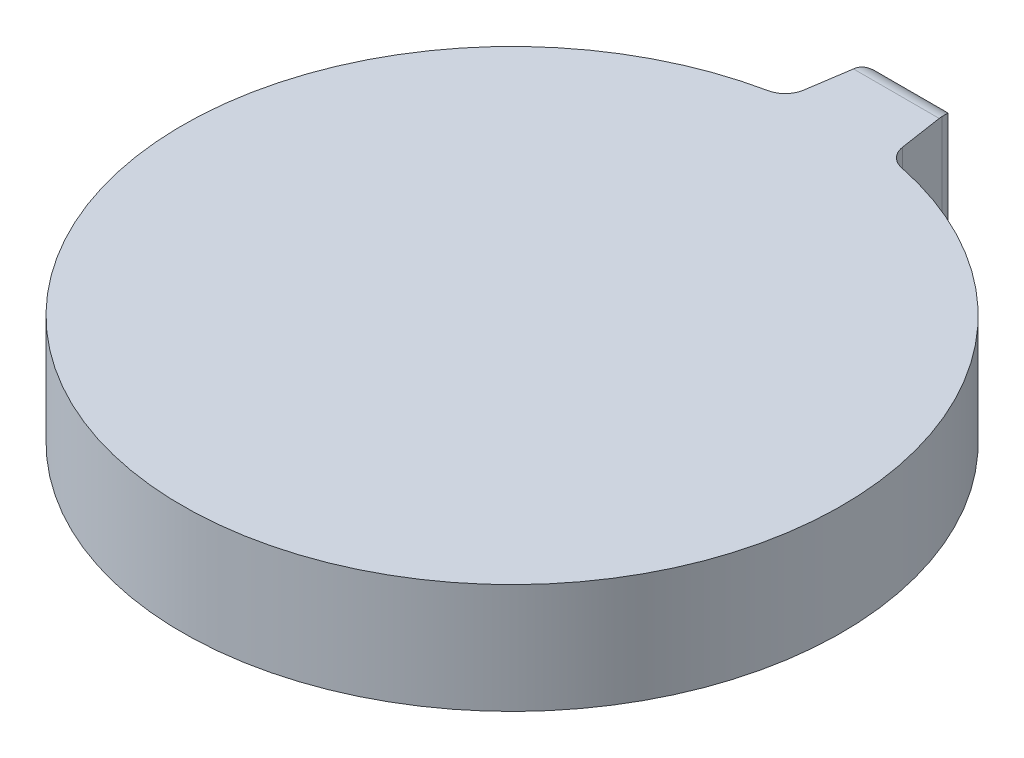
ISO-10303-21;
HEADER;
FILE_DESCRIPTION(('STEP AP214'),'2;1');
FILE_NAME('part.step','',(''),(''),'','','');
FILE_SCHEMA(('AUTOMOTIVE_DESIGN { 1 0 10303 214 1 1 1 1 }'));
ENDSEC;
DATA;
#1=APPLICATION_CONTEXT('core data for automotive mechanical design processes');
#2=APPLICATION_PROTOCOL_DEFINITION('international standard','automotive_design',2000,#1);
#3=PRODUCT_CONTEXT('',#1,'mechanical');
#4=PRODUCT('Part','Part','',(#3));
#5=PRODUCT_RELATED_PRODUCT_CATEGORY('part','',(#4));
#6=PRODUCT_DEFINITION_FORMATION('','',#4);
#7=PRODUCT_DEFINITION_CONTEXT('part definition',#1,'design');
#8=PRODUCT_DEFINITION('design','',#6,#7);
#9=PRODUCT_DEFINITION_SHAPE('','',#8);
#10=(LENGTH_UNIT() NAMED_UNIT(*) SI_UNIT(.MILLI.,.METRE.));
#11=(NAMED_UNIT(*) PLANE_ANGLE_UNIT() SI_UNIT($,.RADIAN.));
#12=(NAMED_UNIT(*) SI_UNIT($,.STERADIAN.) SOLID_ANGLE_UNIT());
#13=UNCERTAINTY_MEASURE_WITH_UNIT(LENGTH_MEASURE(1.E-05),#10,'distance_accuracy_value','');
#14=(GEOMETRIC_REPRESENTATION_CONTEXT(3) GLOBAL_UNCERTAINTY_ASSIGNED_CONTEXT((#13)) GLOBAL_UNIT_ASSIGNED_CONTEXT((#10,
#11,#12)) REPRESENTATION_CONTEXT('',''));
#15=CARTESIAN_POINT('',(0.,0.,0.));
#16=DIRECTION('',(0.,0.,1.));
#17=DIRECTION('',(1.,0.,0.));
#18=AXIS2_PLACEMENT_3D('',#15,#16,#17);
#19=CARTESIAN_POINT('',(0.,6.35,0.));
#20=DIRECTION('',(0.,-1.,0.));
#21=DIRECTION('',(0.,0.,-1.));
#22=AXIS2_PLACEMENT_3D('',#19,#20,#21);
#23=CYLINDRICAL_SURFACE('',#22,19.05);
#24=CARTESIAN_POINT('',(0.,6.35,0.));
#25=DIRECTION('',(0.,1.,0.));
#26=DIRECTION('',(0.,0.,1.));
#27=AXIS2_PLACEMENT_3D('',#24,#25,#26);
#28=CIRCLE('',#27,19.05);
#29=CARTESIAN_POINT('',(-3.85523550242313,6.35,-18.6558210545893));
#30=VERTEX_POINT('',#29);
#31=CARTESIAN_POINT('',(3.85523467298637,6.35,-18.6558212259928));
#32=VERTEX_POINT('',#31);
#33=EDGE_CURVE('E130',#30,#32,#28,.T.);
#34=ORIENTED_EDGE('',*,*,#33,.F.);
#35=DIRECTION('',(0.,-1.,0.));
#36=VECTOR('',#35,1.);
#37=CARTESIAN_POINT('',(-3.85523550242313,6.35,-18.6558210545893));
#38=LINE('',#37,#36);
#39=CARTESIAN_POINT('',(-3.85523550242313,0.,-18.6558210545893));
#40=VERTEX_POINT('',#39);
#41=EDGE_CURVE('E167',#30,#40,#38,.T.);
#42=ORIENTED_EDGE('',*,*,#41,.T.);
#43=CARTESIAN_POINT('',(0.,0.,0.));
#44=DIRECTION('',(0.,1.,0.));
#45=DIRECTION('',(0.,0.,1.));
#46=AXIS2_PLACEMENT_3D('',#43,#44,#45);
#47=CIRCLE('',#46,19.05);
#48=CARTESIAN_POINT('',(3.85523467298637,0.,-18.6558212259928));
#49=VERTEX_POINT('',#48);
#50=EDGE_CURVE('E182',#40,#49,#47,.T.);
#51=ORIENTED_EDGE('',*,*,#50,.T.);
#52=DIRECTION('',(0.,-1.,0.));
#53=VECTOR('',#52,1.);
#54=CARTESIAN_POINT('',(3.85523467298637,6.35,-18.6558212259928));
#55=LINE('',#54,#53);
#56=EDGE_CURVE('E158',#49,#32,#55,.F.);
#57=ORIENTED_EDGE('',*,*,#56,.T.);
#58=EDGE_LOOP('',(#34,#42,#51,#57));
#59=FACE_BOUND('',#58,.T.);
#60=ADVANCED_FACE('F33',(#59),#23,.T.);
#61=CARTESIAN_POINT('',(0.,6.35,0.));
#62=DIRECTION('',(0.,1.,0.));
#63=DIRECTION('',(0.,0.,1.));
#64=AXIS2_PLACEMENT_3D('',#61,#62,#63);
#65=PLANE('',#64);
#66=ORIENTED_EDGE('',*,*,#33,.T.);
#67=CARTESIAN_POINT('',(4.11225031785213,6.35,-19.899542641059));
#68=DIRECTION('',(0.,1.,0.));
#69=DIRECTION('',(0.,0.,1.));
#70=AXIS2_PLACEMENT_3D('',#67,#68,#69);
#71=CIRCLE('',#70,1.27);
#72=CARTESIAN_POINT('',(2.8565442996536,6.35,-19.7095363362689));
#73=VERTEX_POINT('',#72);
#74=EDGE_CURVE('E11',#32,#73,#71,.F.);
#75=ORIENTED_EDGE('',*,*,#74,.T.);
#76=DIRECTION('',(-0.149611263614261,0.,-0.988744896219315));
#77=VECTOR('',#76,1.);
#78=CARTESIAN_POINT('',(2.99211963756051,6.35,-18.8135515008338));
#79=LINE('',#78,#77);
#80=CARTESIAN_POINT('',(2.4781684455693,6.35,-22.2101314488338));
#81=VERTEX_POINT('',#80);
#82=EDGE_CURVE('E190',#73,#81,#79,.T.);
#83=ORIENTED_EDGE('',*,*,#82,.T.);
#84=DIRECTION('',(1.,0.,0.));
#85=VECTOR('',#84,1.);
#86=CARTESIAN_POINT('',(0.,6.35,-22.2101314488338));
#87=LINE('',#86,#85);
#88=CARTESIAN_POINT('',(-2.47816972024621,6.35,-22.2101314488338));
#89=VERTEX_POINT('',#88);
#90=EDGE_CURVE('E146',#81,#89,#87,.F.);
#91=ORIENTED_EDGE('',*,*,#90,.T.);
#92=DIRECTION('',(0.149611102186031,0.,-0.988744920645705));
#93=VECTOR('',#92,1.);
#94=CARTESIAN_POINT('',(-2.99212036243949,6.35,-18.8135513855485));
#95=LINE('',#94,#93);
#96=CARTESIAN_POINT('',(-2.85654515336463,6.35,-19.7095363584523));
#97=VERTEX_POINT('',#96);
#98=EDGE_CURVE('E186',#97,#89,#95,.T.);
#99=ORIENTED_EDGE('',*,*,#98,.F.);
#100=CARTESIAN_POINT('',(-4.11225120258467,6.35,-19.8995424582285));
#101=DIRECTION('',(0.,1.,0.));
#102=DIRECTION('',(0.,0.,1.));
#103=AXIS2_PLACEMENT_3D('',#100,#101,#102);
#104=CIRCLE('',#103,1.27);
#105=EDGE_CURVE('E176',#97,#30,#104,.F.);
#106=ORIENTED_EDGE('',*,*,#105,.T.);
#107=EDGE_LOOP('',(#66,#75,#83,#91,#99,#106));
#108=FACE_BOUND('',#107,.T.);
#109=ADVANCED_FACE('F213',(#108),#65,.T.);
#110=CARTESIAN_POINT('',(0.,0.,0.));
#111=DIRECTION('',(0.,1.,0.));
#112=DIRECTION('',(0.,0.,1.));
#113=AXIS2_PLACEMENT_3D('',#110,#111,#112);
#114=PLANE('',#113);
#115=ORIENTED_EDGE('',*,*,#50,.F.);
#116=CARTESIAN_POINT('',(-4.11225120258467,0.,-19.8995424582285));
#117=DIRECTION('',(0.,1.,0.));
#118=DIRECTION('',(0.,0.,1.));
#119=AXIS2_PLACEMENT_3D('',#116,#117,#118);
#120=CIRCLE('',#119,1.27);
#121=CARTESIAN_POINT('',(-2.85654515336463,0.,-19.7095363584523));
#122=VERTEX_POINT('',#121);
#123=EDGE_CURVE('E174',#40,#122,#120,.T.);
#124=ORIENTED_EDGE('',*,*,#123,.T.);
#125=DIRECTION('',(0.149611102186031,0.,-0.988744920645705));
#126=VECTOR('',#125,1.);
#127=CARTESIAN_POINT('',(-2.99212036243949,0.,-18.8135513855485));
#128=LINE('',#127,#126);
#129=CARTESIAN_POINT('',(-2.47816972024621,0.,-22.2101314488338));
#130=VERTEX_POINT('',#129);
#131=EDGE_CURVE('E193',#122,#130,#128,.T.);
#132=ORIENTED_EDGE('',*,*,#131,.T.);
#133=DIRECTION('',(1.,0.,0.));
#134=VECTOR('',#133,1.);
#135=CARTESIAN_POINT('',(2.28599925661404,0.,-22.2101314488338));
#136=LINE('',#135,#134);
#137=CARTESIAN_POINT('',(2.4781684455693,0.,-22.2101314488338));
#138=VERTEX_POINT('',#137);
#139=EDGE_CURVE('E156',#130,#138,#136,.T.);
#140=ORIENTED_EDGE('',*,*,#139,.T.);
#141=DIRECTION('',(-0.149611263614261,0.,-0.988744896219315));
#142=VECTOR('',#141,1.);
#143=CARTESIAN_POINT('',(2.99211963756051,0.,-18.8135515008338));
#144=LINE('',#143,#142);
#145=CARTESIAN_POINT('',(2.8565442996536,0.,-19.7095363362689));
#146=VERTEX_POINT('',#145);
#147=EDGE_CURVE('E165',#146,#138,#144,.T.);
#148=ORIENTED_EDGE('',*,*,#147,.F.);
#149=CARTESIAN_POINT('',(4.11225031785213,0.,-19.899542641059));
#150=DIRECTION('',(0.,1.,0.));
#151=DIRECTION('',(0.,0.,1.));
#152=AXIS2_PLACEMENT_3D('',#149,#150,#151);
#153=CIRCLE('',#152,1.27);
#154=EDGE_CURVE('E41',#146,#49,#153,.T.);
#155=ORIENTED_EDGE('',*,*,#154,.T.);
#156=EDGE_LOOP('',(#115,#124,#132,#140,#148,#155));
#157=FACE_BOUND('',#156,.T.);
#158=ADVANCED_FACE('F181',(#157),#114,.F.);
#159=CARTESIAN_POINT('',(2.99211963756051,6.35,-18.8135515008338));
#160=DIRECTION('',(-0.988744896219315,0.,0.149611263614261));
#161=DIRECTION('',(0.149611263614261,0.,0.988744896219315));
#162=AXIS2_PLACEMENT_3D('',#159,#160,#161);
#163=PLANE('',#162);
#164=ORIENTED_EDGE('',*,*,#82,.F.);
#165=DIRECTION('',(0.,1.,0.));
#166=VECTOR('',#165,1.);
#167=CARTESIAN_POINT('',(2.8565442996536,0.,-19.7095363362689));
#168=LINE('',#167,#166);
#169=EDGE_CURVE('E172',#73,#146,#168,.F.);
#170=ORIENTED_EDGE('',*,*,#169,.T.);
#171=ORIENTED_EDGE('',*,*,#147,.T.);
#172=CARTESIAN_POINT('',(2.4781684455693,1.27,-22.2101314488338));
#173=DIRECTION('',(-0.988744896219315,0.,0.149611263614261));
#174=DIRECTION('',(-0.149611263614261,0.,-0.988744896219315));
#175=AXIS2_PLACEMENT_3D('',#172,#173,#174);
#176=ELLIPSE('',#175,1.28445669338585,1.27);
#177=CARTESIAN_POINT('',(2.44941777038197,0.0142939818014418,-22.4001377536239));
#178=VERTEX_POINT('',#177);
#179=EDGE_CURVE('E136',#138,#178,#176,.F.);
#180=ORIENTED_EDGE('',*,*,#179,.T.);
#181=DIRECTION('',(0.,-1.,0.));
#182=VECTOR('',#181,1.);
#183=CARTESIAN_POINT('',(2.44941777038197,6.35,-22.4001377536239));
#184=LINE('',#183,#182);
#185=CARTESIAN_POINT('',(2.44941777038197,6.33570601819856,-22.4001377536239));
#186=VERTEX_POINT('',#185);
#187=EDGE_CURVE('E116',#178,#186,#184,.F.);
#188=ORIENTED_EDGE('',*,*,#187,.T.);
#189=CARTESIAN_POINT('',(2.4781684455693,5.08,-22.2101314488338));
#190=DIRECTION('',(-0.988744896219315,0.,0.149611263614261));
#191=DIRECTION('',(0.149611263614261,0.,0.988744896219315));
#192=AXIS2_PLACEMENT_3D('',#189,#190,#191);
#193=ELLIPSE('',#192,1.28445669338585,1.27);
#194=EDGE_CURVE('E143',#186,#81,#193,.F.);
#195=ORIENTED_EDGE('',*,*,#194,.T.);
#196=EDGE_LOOP('',(#164,#170,#171,#180,#188,#195));
#197=FACE_BOUND('',#196,.T.);
#198=ADVANCED_FACE('F189',(#197),#163,.F.);
#199=CARTESIAN_POINT('',(-2.28600074338596,6.35,-23.4801314488338));
#200=DIRECTION('',(0.,0.,-1.));
#201=DIRECTION('',(-1.,0.,0.));
#202=AXIS2_PLACEMENT_3D('',#199,#200,#201);
#203=PLANE('',#202);
#204=DIRECTION('',(1.,0.,0.));
#205=VECTOR('',#204,1.);
#206=CARTESIAN_POINT('',(-2.28600074338596,5.08,-23.4801314488338));
#207=LINE('',#206,#205);
#208=CARTESIAN_POINT('',(-1.19371305859214,5.08,-23.4801314488338));
#209=VERTEX_POINT('',#208);
#210=CARTESIAN_POINT('',(1.19371175218344,5.08,-23.4801314488338));
#211=VERTEX_POINT('',#210);
#212=EDGE_CURVE('E134',#209,#211,#207,.T.);
#213=ORIENTED_EDGE('',*,*,#212,.T.);
#214=DIRECTION('',(0.,-1.,0.));
#215=VECTOR('',#214,1.);
#216=CARTESIAN_POINT('',(1.19371175218344,0.,-23.4801314488338));
#217=LINE('',#216,#215);
#218=CARTESIAN_POINT('',(1.19371175218344,1.27,-23.4801314488338));
#219=VERTEX_POINT('',#218);
#220=EDGE_CURVE('E114',#211,#219,#217,.T.);
#221=ORIENTED_EDGE('',*,*,#220,.T.);
#222=DIRECTION('',(1.,0.,0.));
#223=VECTOR('',#222,1.);
#224=CARTESIAN_POINT('',(-2.28600074338596,1.27,-23.4801314488338));
#225=LINE('',#224,#223);
#226=CARTESIAN_POINT('',(-1.19371305859214,1.27,-23.4801314488338));
#227=VERTEX_POINT('',#226);
#228=EDGE_CURVE('E122',#219,#227,#225,.F.);
#229=ORIENTED_EDGE('',*,*,#228,.T.);
#230=DIRECTION('',(0.,-1.,0.));
#231=VECTOR('',#230,1.);
#232=CARTESIAN_POINT('',(-1.19371305859214,6.35,-23.4801314488338));
#233=LINE('',#232,#231);
#234=EDGE_CURVE('E129',#227,#209,#233,.F.);
#235=ORIENTED_EDGE('',*,*,#234,.T.);
#236=EDGE_LOOP('',(#213,#221,#229,#235));
#237=FACE_BOUND('',#236,.T.);
#238=ADVANCED_FACE('F132',(#237),#203,.T.);
#239=CARTESIAN_POINT('',(-2.99212036243949,6.35,-18.8135513855485));
#240=DIRECTION('',(-0.988744920645705,0.,-0.149611102186031));
#241=DIRECTION('',(-0.149611102186031,0.,0.988744920645705));
#242=AXIS2_PLACEMENT_3D('',#239,#240,#241);
#243=PLANE('',#242);
#244=ORIENTED_EDGE('',*,*,#131,.F.);
#245=DIRECTION('',(0.,-1.,0.));
#246=VECTOR('',#245,1.);
#247=CARTESIAN_POINT('',(-2.85654515336463,6.35,-19.7095363584523));
#248=LINE('',#247,#246);
#249=EDGE_CURVE('E170',#122,#97,#248,.F.);
#250=ORIENTED_EDGE('',*,*,#249,.T.);
#251=ORIENTED_EDGE('',*,*,#98,.T.);
#252=CARTESIAN_POINT('',(-2.47816972024621,5.08,-22.2101314488338));
#253=DIRECTION('',(-0.988744920645705,0.,-0.149611102186031));
#254=DIRECTION('',(0.149611102186031,0.,-0.988744920645705));
#255=AXIS2_PLACEMENT_3D('',#252,#253,#254);
#256=ELLIPSE('',#255,1.28445666165407,1.27);
#257=CARTESIAN_POINT('',(-2.44941910781219,6.33570604922007,-22.40013754861));
#258=VERTEX_POINT('',#257);
#259=EDGE_CURVE('E154',#89,#258,#256,.T.);
#260=ORIENTED_EDGE('',*,*,#259,.T.);
#261=DIRECTION('',(0.,-1.,0.));
#262=VECTOR('',#261,1.);
#263=CARTESIAN_POINT('',(-2.44941910781219,6.35,-22.40013754861));
#264=LINE('',#263,#262);
#265=CARTESIAN_POINT('',(-2.44941910781219,0.0142939507799267,-22.40013754861));
#266=VERTEX_POINT('',#265);
#267=EDGE_CURVE('E152',#258,#266,#264,.T.);
#268=ORIENTED_EDGE('',*,*,#267,.T.);
#269=CARTESIAN_POINT('',(-2.47816972024621,1.27,-22.2101314488338));
#270=DIRECTION('',(-0.988744920645705,0.,-0.149611102186031));
#271=DIRECTION('',(-0.149611102186031,0.,0.988744920645705));
#272=AXIS2_PLACEMENT_3D('',#269,#270,#271);
#273=ELLIPSE('',#272,1.28445666165407,1.27);
#274=EDGE_CURVE('E149',#266,#130,#273,.T.);
#275=ORIENTED_EDGE('',*,*,#274,.T.);
#276=EDGE_LOOP('',(#244,#250,#251,#260,#268,#275));
#277=FACE_BOUND('',#276,.T.);
#278=ADVANCED_FACE('F210',(#277),#243,.T.);
#279=CARTESIAN_POINT('',(-1.19371305859214,6.35,-22.2101314488338));
#280=DIRECTION('',(0.,-1.,0.));
#281=DIRECTION('',(0.,0.,-1.));
#282=AXIS2_PLACEMENT_3D('',#279,#280,#281);
#283=CYLINDRICAL_SURFACE('',#282,1.27);
#284=CARTESIAN_POINT('',(-1.19371305859214,1.27,-22.2101314488338));
#285=DIRECTION('',(-0.707106781186547,0.707106781186547,0.));
#286=DIRECTION('',(-0.707106781186547,-0.707106781186547,0.));
#287=AXIS2_PLACEMENT_3D('',#284,#285,#286);
#288=ELLIPSE('',#287,1.79605122421383,1.27);
#289=EDGE_CURVE('E126',#266,#227,#288,.F.);
#290=ORIENTED_EDGE('',*,*,#289,.F.);
#291=ORIENTED_EDGE('',*,*,#267,.F.);
#292=CARTESIAN_POINT('',(-1.19371305859214,5.08,-22.2101314488338));
#293=DIRECTION('',(-0.707106781186547,-0.707106781186547,0.));
#294=DIRECTION('',(0.707106781186547,-0.707106781186547,0.));
#295=AXIS2_PLACEMENT_3D('',#292,#293,#294);
#296=ELLIPSE('',#295,1.79605122421383,1.27);
#297=EDGE_CURVE('E162',#209,#258,#296,.F.);
#298=ORIENTED_EDGE('',*,*,#297,.F.);
#299=ORIENTED_EDGE('',*,*,#234,.F.);
#300=EDGE_LOOP('',(#290,#291,#298,#299));
#301=FACE_BOUND('',#300,.T.);
#302=ADVANCED_FACE('F202',(#301),#283,.T.);
#303=CARTESIAN_POINT('',(-2.28600074338596,5.08,-22.2101314488338));
#304=DIRECTION('',(1.,0.,0.));
#305=DIRECTION('',(0.,0.,-1.));
#306=AXIS2_PLACEMENT_3D('',#303,#304,#305);
#307=CYLINDRICAL_SURFACE('',#306,1.27);
#308=ORIENTED_EDGE('',*,*,#90,.F.);
#309=ORIENTED_EDGE('',*,*,#194,.F.);
#310=CARTESIAN_POINT('',(1.19371175218344,5.08,-22.2101314488338));
#311=DIRECTION('',(0.707106781186547,-0.707106781186547,0.));
#312=DIRECTION('',(0.707106781186547,0.707106781186547,0.));
#313=AXIS2_PLACEMENT_3D('',#310,#311,#312);
#314=ELLIPSE('',#313,1.79605122421383,1.27);
#315=EDGE_CURVE('E119',#211,#186,#314,.T.);
#316=ORIENTED_EDGE('',*,*,#315,.F.);
#317=ORIENTED_EDGE('',*,*,#212,.F.);
#318=ORIENTED_EDGE('',*,*,#297,.T.);
#319=ORIENTED_EDGE('',*,*,#259,.F.);
#320=EDGE_LOOP('',(#308,#309,#316,#317,#318,#319));
#321=FACE_BOUND('',#320,.T.);
#322=ADVANCED_FACE('F205',(#321),#307,.T.);
#323=CARTESIAN_POINT('',(0.,1.27,-22.2101314488338));
#324=DIRECTION('',(-1.,0.,0.));
#325=DIRECTION('',(0.,0.,1.));
#326=AXIS2_PLACEMENT_3D('',#323,#324,#325);
#327=CYLINDRICAL_SURFACE('',#326,1.27);
#328=ORIENTED_EDGE('',*,*,#289,.T.);
#329=ORIENTED_EDGE('',*,*,#228,.F.);
#330=CARTESIAN_POINT('',(1.19371175218344,1.27,-22.2101314488338));
#331=DIRECTION('',(-0.707106781186547,-0.707106781186547,0.));
#332=DIRECTION('',(-0.707106781186547,0.707106781186547,0.));
#333=AXIS2_PLACEMENT_3D('',#330,#331,#332);
#334=ELLIPSE('',#333,1.79605122421383,1.27);
#335=EDGE_CURVE('E110',#178,#219,#334,.F.);
#336=ORIENTED_EDGE('',*,*,#335,.F.);
#337=ORIENTED_EDGE('',*,*,#179,.F.);
#338=ORIENTED_EDGE('',*,*,#139,.F.);
#339=ORIENTED_EDGE('',*,*,#274,.F.);
#340=EDGE_LOOP('',(#328,#329,#336,#337,#338,#339));
#341=FACE_BOUND('',#340,.T.);
#342=ADVANCED_FACE('F123',(#341),#327,.T.);
#343=CARTESIAN_POINT('',(1.19371175218344,6.35,-22.2101314488338));
#344=DIRECTION('',(0.,1.,0.));
#345=DIRECTION('',(0.,0.,1.));
#346=AXIS2_PLACEMENT_3D('',#343,#344,#345);
#347=CYLINDRICAL_SURFACE('',#346,1.27);
#348=ORIENTED_EDGE('',*,*,#315,.T.);
#349=ORIENTED_EDGE('',*,*,#187,.F.);
#350=ORIENTED_EDGE('',*,*,#335,.T.);
#351=ORIENTED_EDGE('',*,*,#220,.F.);
#352=EDGE_LOOP('',(#348,#349,#350,#351));
#353=FACE_BOUND('',#352,.T.);
#354=ADVANCED_FACE('F112',(#353),#347,.T.);
#355=CARTESIAN_POINT('',(-4.11225120258467,6.35,-19.8995424582285));
#356=DIRECTION('',(0.,-1.,0.));
#357=DIRECTION('',(0.,0.,-1.));
#358=AXIS2_PLACEMENT_3D('',#355,#356,#357);
#359=CYLINDRICAL_SURFACE('',#358,1.27);
#360=ORIENTED_EDGE('',*,*,#105,.F.);
#361=ORIENTED_EDGE('',*,*,#249,.F.);
#362=ORIENTED_EDGE('',*,*,#123,.F.);
#363=ORIENTED_EDGE('',*,*,#41,.F.);
#364=EDGE_LOOP('',(#360,#361,#362,#363));
#365=FACE_BOUND('',#364,.T.);
#366=ADVANCED_FACE('F227',(#365),#359,.F.);
#367=CARTESIAN_POINT('',(4.11225031785213,6.35,-19.899542641059));
#368=DIRECTION('',(0.,-1.,0.));
#369=DIRECTION('',(0.,0.,-1.));
#370=AXIS2_PLACEMENT_3D('',#367,#368,#369);
#371=CYLINDRICAL_SURFACE('',#370,1.27);
#372=ORIENTED_EDGE('',*,*,#74,.F.);
#373=ORIENTED_EDGE('',*,*,#56,.F.);
#374=ORIENTED_EDGE('',*,*,#154,.F.);
#375=ORIENTED_EDGE('',*,*,#169,.F.);
#376=EDGE_LOOP('',(#372,#373,#374,#375));
#377=FACE_BOUND('',#376,.T.);
#378=ADVANCED_FACE('F35',(#377),#371,.F.);
#379=CLOSED_SHELL('',(#60,#109,#158,#198,#238,#278,#302,#322,#342,#354,#366,#378));
#380=MANIFOLD_SOLID_BREP('B2',#379);
#381=ADVANCED_BREP_SHAPE_REPRESENTATION('',(#18,#380),#14);
#382=SHAPE_DEFINITION_REPRESENTATION(#9,#381);
ENDSEC;
END-ISO-10303-21;
